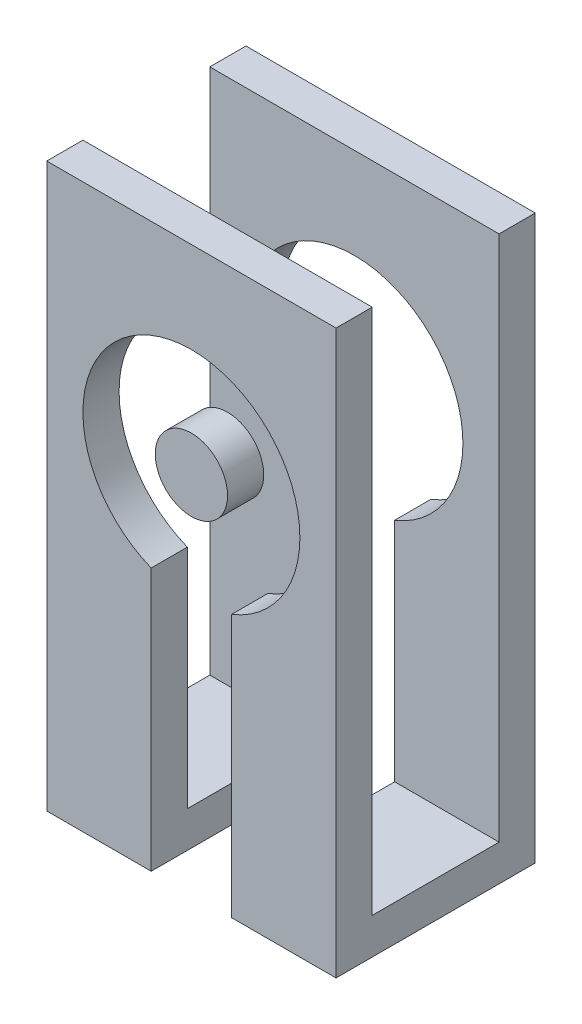
ISO-10303-21;
HEADER;
FILE_DESCRIPTION(('STEP AP214'),'2;1');
FILE_NAME('part.step','',(''),(''),'','','');
FILE_SCHEMA(('AUTOMOTIVE_DESIGN { 1 0 10303 214 1 1 1 1 }'));
ENDSEC;
DATA;
#1=APPLICATION_CONTEXT('core data for automotive mechanical design processes');
#2=APPLICATION_PROTOCOL_DEFINITION('international standard','automotive_design',2000,#1);
#3=PRODUCT_CONTEXT('',#1,'mechanical');
#4=PRODUCT('Part','Part','',(#3));
#5=PRODUCT_RELATED_PRODUCT_CATEGORY('part','',(#4));
#6=PRODUCT_DEFINITION_FORMATION('','',#4);
#7=PRODUCT_DEFINITION_CONTEXT('part definition',#1,'design');
#8=PRODUCT_DEFINITION('design','',#6,#7);
#9=PRODUCT_DEFINITION_SHAPE('','',#8);
#10=(LENGTH_UNIT() NAMED_UNIT(*) SI_UNIT(.MILLI.,.METRE.));
#11=(NAMED_UNIT(*) PLANE_ANGLE_UNIT() SI_UNIT($,.RADIAN.));
#12=(NAMED_UNIT(*) SI_UNIT($,.STERADIAN.) SOLID_ANGLE_UNIT());
#13=UNCERTAINTY_MEASURE_WITH_UNIT(LENGTH_MEASURE(1.E-05),#10,'distance_accuracy_value','');
#14=(GEOMETRIC_REPRESENTATION_CONTEXT(3) GLOBAL_UNCERTAINTY_ASSIGNED_CONTEXT((#13)) GLOBAL_UNIT_ASSIGNED_CONTEXT((#10,
#11,#12)) REPRESENTATION_CONTEXT('',''));
#15=CARTESIAN_POINT('',(0.,0.,0.));
#16=DIRECTION('',(0.,0.,1.));
#17=DIRECTION('',(1.,0.,0.));
#18=AXIS2_PLACEMENT_3D('',#15,#16,#17);
#19=CARTESIAN_POINT('',(-20.,-45.2531458099855,-6.6055019568257));
#20=DIRECTION('',(0.,1.,0.));
#21=DIRECTION('',(0.,0.,1.));
#22=AXIS2_PLACEMENT_3D('',#19,#20,#21);
#23=PLANE('',#22);
#24=DIRECTION('',(0.,0.,-1.));
#25=VECTOR('',#24,1.);
#26=CARTESIAN_POINT('',(5.5576064521285,-45.2531458099855,-6.6055019568257));
#27=LINE('',#26,#25);
#28=CARTESIAN_POINT('',(5.5576064521285,-45.2531458099855,10.9381302617935));
#29=VERTEX_POINT('',#28);
#30=CARTESIAN_POINT('',(5.5576064521285,-45.2531458099855,-6.6055019568257));
#31=VERTEX_POINT('',#30);
#32=EDGE_CURVE('E171',#29,#31,#27,.T.);
#33=ORIENTED_EDGE('',*,*,#32,.F.);
#34=DIRECTION('',(1.,0.,0.));
#35=VECTOR('',#34,1.);
#36=CARTESIAN_POINT('',(-20.,-45.2531458099855,10.9381302617935));
#37=LINE('',#36,#35);
#38=CARTESIAN_POINT('',(20.,-45.2531458099855,10.9381302617935));
#39=VERTEX_POINT('',#38);
#40=EDGE_CURVE('E258',#29,#39,#37,.T.);
#41=ORIENTED_EDGE('',*,*,#40,.T.);
#42=DIRECTION('',(0.,0.,1.));
#43=VECTOR('',#42,1.);
#44=CARTESIAN_POINT('',(20.,-45.2531458099855,-6.6055019568257));
#45=LINE('',#44,#43);
#46=CARTESIAN_POINT('',(20.,-45.2531458099855,-6.6055019568257));
#47=VERTEX_POINT('',#46);
#48=EDGE_CURVE('E187',#47,#39,#45,.T.);
#49=ORIENTED_EDGE('',*,*,#48,.F.);
#50=DIRECTION('',(1.,0.,0.));
#51=VECTOR('',#50,1.);
#52=CARTESIAN_POINT('',(-20.,-45.2531458099855,-6.6055019568257));
#53=LINE('',#52,#51);
#54=EDGE_CURVE('E256',#31,#47,#53,.T.);
#55=ORIENTED_EDGE('',*,*,#54,.F.);
#56=EDGE_LOOP('',(#33,#41,#49,#55));
#57=FACE_BOUND('',#56,.T.);
#58=ADVANCED_FACE('F48',(#57),#23,.T.);
#59=CARTESIAN_POINT('',(-20.,-50.2531458099855,-11.6055019568257));
#60=DIRECTION('',(0.,-1.,0.));
#61=DIRECTION('',(0.,0.,-1.));
#62=AXIS2_PLACEMENT_3D('',#59,#60,#61);
#63=PLANE('',#62);
#64=DIRECTION('',(0.,0.,1.));
#65=VECTOR('',#64,1.);
#66=CARTESIAN_POINT('',(5.5576064521285,-50.2531458099855,-11.6055019568257));
#67=LINE('',#66,#65);
#68=CARTESIAN_POINT('',(5.5576064521285,-50.2531458099855,-11.6055019568257));
#69=VERTEX_POINT('',#68);
#70=CARTESIAN_POINT('',(5.5576064521285,-50.2531458099855,15.9381302617935));
#71=VERTEX_POINT('',#70);
#72=EDGE_CURVE('E194',#69,#71,#67,.T.);
#73=ORIENTED_EDGE('',*,*,#72,.F.);
#74=DIRECTION('',(1.,0.,0.));
#75=VECTOR('',#74,1.);
#76=CARTESIAN_POINT('',(-20.,-50.2531458099855,-11.6055019568257));
#77=LINE('',#76,#75);
#78=CARTESIAN_POINT('',(20.,-50.2531458099855,-11.6055019568257));
#79=VERTEX_POINT('',#78);
#80=EDGE_CURVE('E219',#69,#79,#77,.T.);
#81=ORIENTED_EDGE('',*,*,#80,.T.);
#82=DIRECTION('',(0.,0.,-1.));
#83=VECTOR('',#82,1.);
#84=CARTESIAN_POINT('',(20.,-50.2531458099855,-11.6055019568257));
#85=LINE('',#84,#83);
#86=CARTESIAN_POINT('',(20.,-50.2531458099855,15.9381302617935));
#87=VERTEX_POINT('',#86);
#88=EDGE_CURVE('E228',#87,#79,#85,.T.);
#89=ORIENTED_EDGE('',*,*,#88,.F.);
#90=DIRECTION('',(1.,0.,0.));
#91=VECTOR('',#90,1.);
#92=CARTESIAN_POINT('',(-20.,-50.2531458099855,15.9381302617935));
#93=LINE('',#92,#91);
#94=EDGE_CURVE('E227',#71,#87,#93,.T.);
#95=ORIENTED_EDGE('',*,*,#94,.F.);
#96=EDGE_LOOP('',(#73,#81,#89,#95));
#97=FACE_BOUND('',#96,.T.);
#98=ADVANCED_FACE('F224',(#97),#63,.T.);
#99=DIRECTION('',(0.,0.,1.));
#100=VECTOR('',#99,1.);
#101=CARTESIAN_POINT('',(-5.5576064521285,-45.2531458099855,-6.6055019568257));
#102=LINE('',#101,#100);
#103=CARTESIAN_POINT('',(-5.5576064521285,-45.2531458099855,-6.6055019568257));
#104=VERTEX_POINT('',#103);
#105=CARTESIAN_POINT('',(-5.5576064521285,-45.2531458099855,10.9381302617935));
#106=VERTEX_POINT('',#105);
#107=EDGE_CURVE('E95',#104,#106,#102,.T.);
#108=ORIENTED_EDGE('',*,*,#107,.F.);
#109=CARTESIAN_POINT('',(-20.,-45.2531458099855,-6.6055019568257));
#110=VERTEX_POINT('',#109);
#111=EDGE_CURVE('E280',#110,#104,#53,.T.);
#112=ORIENTED_EDGE('',*,*,#111,.F.);
#113=DIRECTION('',(0.,0.,1.));
#114=VECTOR('',#113,1.);
#115=CARTESIAN_POINT('',(-20.,-45.2531458099855,-6.6055019568257));
#116=LINE('',#115,#114);
#117=CARTESIAN_POINT('',(-20.,-45.2531458099855,10.9381302617935));
#118=VERTEX_POINT('',#117);
#119=EDGE_CURVE('E257',#110,#118,#116,.T.);
#120=ORIENTED_EDGE('',*,*,#119,.T.);
#121=EDGE_CURVE('E254',#118,#106,#37,.T.);
#122=ORIENTED_EDGE('',*,*,#121,.T.);
#123=EDGE_LOOP('',(#108,#112,#120,#122));
#124=FACE_BOUND('',#123,.T.);
#125=ADVANCED_FACE('F320',(#124),#23,.T.);
#126=CARTESIAN_POINT('',(-20.,-45.2531458099855,-6.6055019568257));
#127=DIRECTION('',(0.,0.,1.));
#128=DIRECTION('',(1.,0.,0.));
#129=AXIS2_PLACEMENT_3D('',#126,#127,#128);
#130=PLANE('',#129);
#131=DIRECTION('',(0.,1.,0.));
#132=VECTOR('',#131,1.);
#133=CARTESIAN_POINT('',(5.5576064521285,-45.2531458099855,-6.6055019568257));
#134=LINE('',#133,#132);
#135=CARTESIAN_POINT('',(5.5576064521285,-13.9324445279089,-6.6055019568257));
#136=VERTEX_POINT('',#135);
#137=EDGE_CURVE('E167',#31,#136,#134,.T.);
#138=ORIENTED_EDGE('',*,*,#137,.F.);
#139=ORIENTED_EDGE('',*,*,#54,.T.);
#140=DIRECTION('',(0.,-1.,0.));
#141=VECTOR('',#140,1.);
#142=CARTESIAN_POINT('',(20.,-45.2531458099855,-6.6055019568257));
#143=LINE('',#142,#141);
#144=CARTESIAN_POINT('',(20.,27.5804653060911,-6.6055019568257));
#145=VERTEX_POINT('',#144);
#146=EDGE_CURVE('E205',#145,#47,#143,.T.);
#147=ORIENTED_EDGE('',*,*,#146,.F.);
#148=DIRECTION('',(1.,0.,0.));
#149=VECTOR('',#148,1.);
#150=CARTESIAN_POINT('',(-20.,27.5804653060911,-6.6055019568257));
#151=LINE('',#150,#149);
#152=CARTESIAN_POINT('',(-20.,27.5804653060911,-6.6055019568257));
#153=VERTEX_POINT('',#152);
#154=EDGE_CURVE('E277',#153,#145,#151,.T.);
#155=ORIENTED_EDGE('',*,*,#154,.F.);
#156=DIRECTION('',(0.,-1.,0.));
#157=VECTOR('',#156,1.);
#158=CARTESIAN_POINT('',(-20.,-45.2531458099855,-6.6055019568257));
#159=LINE('',#158,#157);
#160=EDGE_CURVE('E282',#153,#110,#159,.T.);
#161=ORIENTED_EDGE('',*,*,#160,.T.);
#162=ORIENTED_EDGE('',*,*,#111,.T.);
#163=DIRECTION('',(0.,-1.,0.));
#164=VECTOR('',#163,1.);
#165=CARTESIAN_POINT('',(-5.5576064521285,-45.2531458099855,-6.6055019568257));
#166=LINE('',#165,#164);
#167=CARTESIAN_POINT('',(-5.5576064521285,-13.9324445279089,-6.6055019568257));
#168=VERTEX_POINT('',#167);
#169=EDGE_CURVE('E183',#168,#104,#166,.T.);
#170=ORIENTED_EDGE('',*,*,#169,.F.);
#171=CARTESIAN_POINT('',(0.,0.,-6.6055019568257));
#172=DIRECTION('',(0.,0.,1.));
#173=DIRECTION('',(1.,0.,0.));
#174=AXIS2_PLACEMENT_3D('',#171,#172,#173);
#175=CIRCLE('',#174,15.);
#176=EDGE_CURVE('E178',#136,#168,#175,.T.);
#177=ORIENTED_EDGE('',*,*,#176,.F.);
#178=EDGE_LOOP('',(#138,#139,#147,#155,#161,#162,#170,#177));
#179=FACE_BOUND('',#178,.T.);
#180=ADVANCED_FACE('F181',(#179),#130,.T.);
#181=CARTESIAN_POINT('',(-20.,27.5804653060911,-6.6055019568257));
#182=DIRECTION('',(0.,1.,0.));
#183=DIRECTION('',(0.,0.,1.));
#184=AXIS2_PLACEMENT_3D('',#181,#182,#183);
#185=PLANE('',#184);
#186=ORIENTED_EDGE('',*,*,#154,.T.);
#187=DIRECTION('',(0.,0.,1.));
#188=VECTOR('',#187,1.);
#189=CARTESIAN_POINT('',(20.,27.5804653060911,-6.6055019568257));
#190=LINE('',#189,#188);
#191=CARTESIAN_POINT('',(20.,27.5804653060911,-11.6055019568257));
#192=VERTEX_POINT('',#191);
#193=EDGE_CURVE('E295',#192,#145,#190,.T.);
#194=ORIENTED_EDGE('',*,*,#193,.F.);
#195=DIRECTION('',(1.,0.,0.));
#196=VECTOR('',#195,1.);
#197=CARTESIAN_POINT('',(-20.,27.5804653060911,-11.6055019568257));
#198=LINE('',#197,#196);
#199=CARTESIAN_POINT('',(-20.,27.5804653060911,-11.6055019568257));
#200=VERTEX_POINT('',#199);
#201=EDGE_CURVE('E274',#200,#192,#198,.T.);
#202=ORIENTED_EDGE('',*,*,#201,.F.);
#203=DIRECTION('',(0.,0.,1.));
#204=VECTOR('',#203,1.);
#205=CARTESIAN_POINT('',(-20.,27.5804653060911,-6.6055019568257));
#206=LINE('',#205,#204);
#207=EDGE_CURVE('E279',#200,#153,#206,.T.);
#208=ORIENTED_EDGE('',*,*,#207,.T.);
#209=EDGE_LOOP('',(#186,#194,#202,#208));
#210=FACE_BOUND('',#209,.T.);
#211=ADVANCED_FACE('F312',(#210),#185,.T.);
#212=CARTESIAN_POINT('',(-20.,-50.2531458099855,-11.6055019568257));
#213=DIRECTION('',(0.,0.,-1.));
#214=DIRECTION('',(-1.,0.,0.));
#215=AXIS2_PLACEMENT_3D('',#212,#213,#214);
#216=PLANE('',#215);
#217=DIRECTION('',(0.,-1.,0.));
#218=VECTOR('',#217,1.);
#219=CARTESIAN_POINT('',(5.5576064521285,-50.2531458099855,-11.6055019568257));
#220=LINE('',#219,#218);
#221=CARTESIAN_POINT('',(5.5576064521285,-13.9324445279089,-11.6055019568257));
#222=VERTEX_POINT('',#221);
#223=EDGE_CURVE('E192',#222,#69,#220,.T.);
#224=ORIENTED_EDGE('',*,*,#223,.F.);
#225=CARTESIAN_POINT('',(0.,0.,-11.6055019568257));
#226=DIRECTION('',(0.,0.,-1.));
#227=DIRECTION('',(-1.,0.,0.));
#228=AXIS2_PLACEMENT_3D('',#225,#226,#227);
#229=CIRCLE('',#228,15.);
#230=CARTESIAN_POINT('',(-5.5576064521285,-13.9324445279089,-11.6055019568257));
#231=VERTEX_POINT('',#230);
#232=EDGE_CURVE('E58',#231,#222,#229,.T.);
#233=ORIENTED_EDGE('',*,*,#232,.F.);
#234=DIRECTION('',(0.,1.,0.));
#235=VECTOR('',#234,1.);
#236=CARTESIAN_POINT('',(-5.5576064521285,-50.2531458099855,-11.6055019568257));
#237=LINE('',#236,#235);
#238=CARTESIAN_POINT('',(-5.5576064521285,-50.2531458099855,-11.6055019568257));
#239=VERTEX_POINT('',#238);
#240=EDGE_CURVE('E201',#239,#231,#237,.T.);
#241=ORIENTED_EDGE('',*,*,#240,.F.);
#242=CARTESIAN_POINT('',(-20.,-50.2531458099855,-11.6055019568257));
#243=VERTEX_POINT('',#242);
#244=EDGE_CURVE('E233',#243,#239,#77,.T.);
#245=ORIENTED_EDGE('',*,*,#244,.F.);
#246=DIRECTION('',(0.,1.,0.));
#247=VECTOR('',#246,1.);
#248=CARTESIAN_POINT('',(-20.,-50.2531458099855,-11.6055019568257));
#249=LINE('',#248,#247);
#250=EDGE_CURVE('E276',#243,#200,#249,.T.);
#251=ORIENTED_EDGE('',*,*,#250,.T.);
#252=ORIENTED_EDGE('',*,*,#201,.T.);
#253=DIRECTION('',(0.,1.,0.));
#254=VECTOR('',#253,1.);
#255=CARTESIAN_POINT('',(20.,-50.2531458099855,-11.6055019568257));
#256=LINE('',#255,#254);
#257=EDGE_CURVE('E298',#79,#192,#256,.T.);
#258=ORIENTED_EDGE('',*,*,#257,.F.);
#259=ORIENTED_EDGE('',*,*,#80,.F.);
#260=EDGE_LOOP('',(#224,#233,#241,#245,#251,#252,#258,#259));
#261=FACE_BOUND('',#260,.T.);
#262=ADVANCED_FACE('F215',(#261),#216,.T.);
#263=DIRECTION('',(0.,0.,-1.));
#264=VECTOR('',#263,1.);
#265=CARTESIAN_POINT('',(-5.5576064521285,-50.2531458099855,-11.6055019568257));
#266=LINE('',#265,#264);
#267=CARTESIAN_POINT('',(-5.5576064521285,-50.2531458099855,15.9381302617935));
#268=VERTEX_POINT('',#267);
#269=EDGE_CURVE('E195',#268,#239,#266,.T.);
#270=ORIENTED_EDGE('',*,*,#269,.F.);
#271=CARTESIAN_POINT('',(-20.,-50.2531458099855,15.9381302617935));
#272=VERTEX_POINT('',#271);
#273=EDGE_CURVE('E235',#272,#268,#93,.T.);
#274=ORIENTED_EDGE('',*,*,#273,.F.);
#275=DIRECTION('',(0.,0.,-1.));
#276=VECTOR('',#275,1.);
#277=CARTESIAN_POINT('',(-20.,-50.2531458099855,-11.6055019568257));
#278=LINE('',#277,#276);
#279=EDGE_CURVE('E238',#272,#243,#278,.T.);
#280=ORIENTED_EDGE('',*,*,#279,.T.);
#281=ORIENTED_EDGE('',*,*,#244,.T.);
#282=EDGE_LOOP('',(#270,#274,#280,#281));
#283=FACE_BOUND('',#282,.T.);
#284=ADVANCED_FACE('F326',(#283),#63,.T.);
#285=CARTESIAN_POINT('',(-20.,-50.2531458099855,15.9381302617935));
#286=DIRECTION('',(0.,0.,1.));
#287=DIRECTION('',(1.,0.,0.));
#288=AXIS2_PLACEMENT_3D('',#285,#286,#287);
#289=PLANE('',#288);
#290=DIRECTION('',(0.,1.,0.));
#291=VECTOR('',#290,1.);
#292=CARTESIAN_POINT('',(5.5576064521285,-50.2531458099855,15.9381302617935));
#293=LINE('',#292,#291);
#294=CARTESIAN_POINT('',(5.5576064521285,-13.9324445279089,15.9381302617935));
#295=VERTEX_POINT('',#294);
#296=EDGE_CURVE('E197',#71,#295,#293,.T.);
#297=ORIENTED_EDGE('',*,*,#296,.F.);
#298=ORIENTED_EDGE('',*,*,#94,.T.);
#299=DIRECTION('',(0.,-1.,0.));
#300=VECTOR('',#299,1.);
#301=CARTESIAN_POINT('',(20.,-50.2531458099855,15.9381302617935));
#302=LINE('',#301,#300);
#303=CARTESIAN_POINT('',(20.,27.5804653060911,15.9381302617935));
#304=VERTEX_POINT('',#303);
#305=EDGE_CURVE('E302',#304,#87,#302,.T.);
#306=ORIENTED_EDGE('',*,*,#305,.F.);
#307=DIRECTION('',(1.,0.,0.));
#308=VECTOR('',#307,1.);
#309=CARTESIAN_POINT('',(-20.,27.5804653060911,15.9381302617935));
#310=LINE('',#309,#308);
#311=CARTESIAN_POINT('',(-20.,27.5804653060911,15.9381302617935));
#312=VERTEX_POINT('',#311);
#313=EDGE_CURVE('E242',#312,#304,#310,.T.);
#314=ORIENTED_EDGE('',*,*,#313,.F.);
#315=DIRECTION('',(0.,-1.,0.));
#316=VECTOR('',#315,1.);
#317=CARTESIAN_POINT('',(-20.,-50.2531458099855,15.9381302617935));
#318=LINE('',#317,#316);
#319=EDGE_CURVE('E232',#312,#272,#318,.T.);
#320=ORIENTED_EDGE('',*,*,#319,.T.);
#321=ORIENTED_EDGE('',*,*,#273,.T.);
#322=DIRECTION('',(0.,-1.,0.));
#323=VECTOR('',#322,1.);
#324=CARTESIAN_POINT('',(-5.5576064521285,-50.2531458099855,15.9381302617935));
#325=LINE('',#324,#323);
#326=CARTESIAN_POINT('',(-5.5576064521285,-13.9324445279089,15.9381302617935));
#327=VERTEX_POINT('',#326);
#328=EDGE_CURVE('E207',#327,#268,#325,.T.);
#329=ORIENTED_EDGE('',*,*,#328,.F.);
#330=CARTESIAN_POINT('',(0.,0.,15.9381302617935));
#331=DIRECTION('',(0.,0.,1.));
#332=DIRECTION('',(1.,0.,0.));
#333=AXIS2_PLACEMENT_3D('',#330,#331,#332);
#334=CIRCLE('',#333,15.);
#335=EDGE_CURVE('E175',#295,#327,#334,.T.);
#336=ORIENTED_EDGE('',*,*,#335,.F.);
#337=EDGE_LOOP('',(#297,#298,#306,#314,#320,#321,#329,#336));
#338=FACE_BOUND('',#337,.T.);
#339=ADVANCED_FACE('F50',(#338),#289,.T.);
#340=CARTESIAN_POINT('',(-20.,27.5804653060911,15.9381302617935));
#341=DIRECTION('',(0.,1.,0.));
#342=DIRECTION('',(0.,0.,1.));
#343=AXIS2_PLACEMENT_3D('',#340,#341,#342);
#344=PLANE('',#343);
#345=ORIENTED_EDGE('',*,*,#313,.T.);
#346=DIRECTION('',(0.,0.,1.));
#347=VECTOR('',#346,1.);
#348=CARTESIAN_POINT('',(20.,27.5804653060911,15.9381302617935));
#349=LINE('',#348,#347);
#350=CARTESIAN_POINT('',(20.,27.5804653060911,10.9381302617935));
#351=VERTEX_POINT('',#350);
#352=EDGE_CURVE('E304',#351,#304,#349,.T.);
#353=ORIENTED_EDGE('',*,*,#352,.F.);
#354=DIRECTION('',(1.,0.,0.));
#355=VECTOR('',#354,1.);
#356=CARTESIAN_POINT('',(-20.,27.5804653060911,10.9381302617935));
#357=LINE('',#356,#355);
#358=CARTESIAN_POINT('',(-20.,27.5804653060911,10.9381302617935));
#359=VERTEX_POINT('',#358);
#360=EDGE_CURVE('E252',#359,#351,#357,.T.);
#361=ORIENTED_EDGE('',*,*,#360,.F.);
#362=DIRECTION('',(0.,0.,1.));
#363=VECTOR('',#362,1.);
#364=CARTESIAN_POINT('',(-20.,27.5804653060911,15.9381302617935));
#365=LINE('',#364,#363);
#366=EDGE_CURVE('E244',#359,#312,#365,.T.);
#367=ORIENTED_EDGE('',*,*,#366,.T.);
#368=EDGE_LOOP('',(#345,#353,#361,#367));
#369=FACE_BOUND('',#368,.T.);
#370=ADVANCED_FACE('F321',(#369),#344,.T.);
#371=CARTESIAN_POINT('',(-20.,-45.2531458099855,10.9381302617935));
#372=DIRECTION('',(0.,0.,-1.));
#373=DIRECTION('',(-1.,0.,0.));
#374=AXIS2_PLACEMENT_3D('',#371,#372,#373);
#375=PLANE('',#374);
#376=DIRECTION('',(0.,-1.,0.));
#377=VECTOR('',#376,1.);
#378=CARTESIAN_POINT('',(5.5576064521285,-45.2531458099855,10.9381302617935));
#379=LINE('',#378,#377);
#380=CARTESIAN_POINT('',(5.5576064521285,-13.9324445279089,10.9381302617935));
#381=VERTEX_POINT('',#380);
#382=EDGE_CURVE('E198',#381,#29,#379,.T.);
#383=ORIENTED_EDGE('',*,*,#382,.F.);
#384=CARTESIAN_POINT('',(0.,0.,10.9381302617935));
#385=DIRECTION('',(0.,0.,-1.));
#386=DIRECTION('',(-1.,0.,0.));
#387=AXIS2_PLACEMENT_3D('',#384,#385,#386);
#388=CIRCLE('',#387,15.);
#389=CARTESIAN_POINT('',(-5.5576064521285,-13.9324445279089,10.9381302617935));
#390=VERTEX_POINT('',#389);
#391=EDGE_CURVE('E162',#390,#381,#388,.T.);
#392=ORIENTED_EDGE('',*,*,#391,.F.);
#393=DIRECTION('',(0.,1.,0.));
#394=VECTOR('',#393,1.);
#395=CARTESIAN_POINT('',(-5.5576064521285,-45.2531458099855,10.9381302617935));
#396=LINE('',#395,#394);
#397=EDGE_CURVE('E90',#106,#390,#396,.T.);
#398=ORIENTED_EDGE('',*,*,#397,.F.);
#399=ORIENTED_EDGE('',*,*,#121,.F.);
#400=DIRECTION('',(0.,1.,0.));
#401=VECTOR('',#400,1.);
#402=CARTESIAN_POINT('',(-20.,-45.2531458099855,10.9381302617935));
#403=LINE('',#402,#401);
#404=EDGE_CURVE('E249',#118,#359,#403,.T.);
#405=ORIENTED_EDGE('',*,*,#404,.T.);
#406=ORIENTED_EDGE('',*,*,#360,.T.);
#407=DIRECTION('',(0.,1.,0.));
#408=VECTOR('',#407,1.);
#409=CARTESIAN_POINT('',(20.,-45.2531458099855,10.9381302617935));
#410=LINE('',#409,#408);
#411=EDGE_CURVE('E269',#39,#351,#410,.T.);
#412=ORIENTED_EDGE('',*,*,#411,.F.);
#413=ORIENTED_EDGE('',*,*,#40,.F.);
#414=EDGE_LOOP('',(#383,#392,#398,#399,#405,#406,#412,#413));
#415=FACE_BOUND('',#414,.T.);
#416=ADVANCED_FACE('F267',(#415),#375,.T.);
#417=CARTESIAN_POINT('',(-20.,0.,-70.));
#418=DIRECTION('',(-1.,0.,0.));
#419=DIRECTION('',(0.,0.,1.));
#420=AXIS2_PLACEMENT_3D('',#417,#418,#419);
#421=PLANE('',#420);
#422=ORIENTED_EDGE('',*,*,#119,.F.);
#423=ORIENTED_EDGE('',*,*,#160,.F.);
#424=ORIENTED_EDGE('',*,*,#207,.F.);
#425=ORIENTED_EDGE('',*,*,#250,.F.);
#426=ORIENTED_EDGE('',*,*,#279,.F.);
#427=ORIENTED_EDGE('',*,*,#319,.F.);
#428=ORIENTED_EDGE('',*,*,#366,.F.);
#429=ORIENTED_EDGE('',*,*,#404,.F.);
#430=EDGE_LOOP('',(#422,#423,#424,#425,#426,#427,#428,#429));
#431=FACE_BOUND('',#430,.T.);
#432=ADVANCED_FACE('F316',(#431),#421,.T.);
#433=CARTESIAN_POINT('',(20.,0.,-70.));
#434=DIRECTION('',(-1.,0.,0.));
#435=DIRECTION('',(0.,0.,1.));
#436=AXIS2_PLACEMENT_3D('',#433,#434,#435);
#437=PLANE('',#436);
#438=ORIENTED_EDGE('',*,*,#48,.T.);
#439=ORIENTED_EDGE('',*,*,#411,.T.);
#440=ORIENTED_EDGE('',*,*,#352,.T.);
#441=ORIENTED_EDGE('',*,*,#305,.T.);
#442=ORIENTED_EDGE('',*,*,#88,.T.);
#443=ORIENTED_EDGE('',*,*,#257,.T.);
#444=ORIENTED_EDGE('',*,*,#193,.T.);
#445=ORIENTED_EDGE('',*,*,#146,.T.);
#446=EDGE_LOOP('',(#438,#439,#440,#441,#442,#443,#444,#445));
#447=FACE_BOUND('',#446,.T.);
#448=ADVANCED_FACE('F306',(#447),#437,.F.);
#449=CARTESIAN_POINT('',(-5.5576064521285,-13.9324445279089,-30.));
#450=DIRECTION('',(-1.,0.,0.));
#451=DIRECTION('',(0.,0.,1.));
#452=AXIS2_PLACEMENT_3D('',#449,#450,#451);
#453=PLANE('',#452);
#454=ORIENTED_EDGE('',*,*,#240,.T.);
#455=DIRECTION('',(0.,0.,1.));
#456=VECTOR('',#455,1.);
#457=CARTESIAN_POINT('',(-5.5576064521285,-13.9324445279089,-30.));
#458=LINE('',#457,#456);
#459=EDGE_CURVE('E204',#231,#168,#458,.T.);
#460=ORIENTED_EDGE('',*,*,#459,.T.);
#461=ORIENTED_EDGE('',*,*,#169,.T.);
#462=ORIENTED_EDGE('',*,*,#107,.T.);
#463=ORIENTED_EDGE('',*,*,#397,.T.);
#464=EDGE_CURVE('E209',#390,#327,#458,.T.);
#465=ORIENTED_EDGE('',*,*,#464,.T.);
#466=ORIENTED_EDGE('',*,*,#328,.T.);
#467=ORIENTED_EDGE('',*,*,#269,.T.);
#468=EDGE_LOOP('',(#454,#460,#461,#462,#463,#465,#466,#467));
#469=FACE_BOUND('',#468,.T.);
#470=ADVANCED_FACE('F212',(#469),#453,.F.);
#471=CARTESIAN_POINT('',(5.5576064521285,-13.9324445279089,-30.));
#472=DIRECTION('',(1.,0.,0.));
#473=DIRECTION('',(0.,1.,0.));
#474=AXIS2_PLACEMENT_3D('',#471,#472,#473);
#475=PLANE('',#474);
#476=ORIENTED_EDGE('',*,*,#223,.T.);
#477=ORIENTED_EDGE('',*,*,#72,.T.);
#478=ORIENTED_EDGE('',*,*,#296,.T.);
#479=DIRECTION('',(0.,0.,1.));
#480=VECTOR('',#479,1.);
#481=CARTESIAN_POINT('',(5.5576064521285,-13.9324445279089,-30.));
#482=LINE('',#481,#480);
#483=EDGE_CURVE('E52',#381,#295,#482,.T.);
#484=ORIENTED_EDGE('',*,*,#483,.F.);
#485=ORIENTED_EDGE('',*,*,#382,.T.);
#486=ORIENTED_EDGE('',*,*,#32,.T.);
#487=ORIENTED_EDGE('',*,*,#137,.T.);
#488=EDGE_CURVE('E12',#222,#136,#482,.T.);
#489=ORIENTED_EDGE('',*,*,#488,.F.);
#490=EDGE_LOOP('',(#476,#477,#478,#484,#485,#486,#487,#489));
#491=FACE_BOUND('',#490,.T.);
#492=ADVANCED_FACE('F168',(#491),#475,.F.);
#493=CARTESIAN_POINT('',(0.,0.,-30.));
#494=DIRECTION('',(0.,0.,1.));
#495=DIRECTION('',(1.,0.,0.));
#496=AXIS2_PLACEMENT_3D('',#493,#494,#495);
#497=CYLINDRICAL_SURFACE('',#496,15.);
#498=ORIENTED_EDGE('',*,*,#335,.T.);
#499=ORIENTED_EDGE('',*,*,#464,.F.);
#500=ORIENTED_EDGE('',*,*,#391,.T.);
#501=ORIENTED_EDGE('',*,*,#483,.T.);
#502=EDGE_LOOP('',(#498,#499,#500,#501));
#503=FACE_BOUND('',#502,.T.);
#504=ADVANCED_FACE('F328',(#503),#497,.F.);
#505=ORIENTED_EDGE('',*,*,#176,.T.);
#506=ORIENTED_EDGE('',*,*,#459,.F.);
#507=ORIENTED_EDGE('',*,*,#232,.T.);
#508=ORIENTED_EDGE('',*,*,#488,.T.);
#509=EDGE_LOOP('',(#505,#506,#507,#508));
#510=FACE_BOUND('',#509,.T.);
#511=ADVANCED_FACE('F177',(#510),#497,.F.);
#512=CLOSED_SHELL('',(#58,#98,#125,#180,#211,#262,#284,#339,#370,#416,#432,#448,#470,#492,#504,#511));
#513=MANIFOLD_SOLID_BREP('B2',#512);
#514=CARTESIAN_POINT('',(-20.,-45.2531458099855,10.9381302617935));
#515=DIRECTION('',(0.,0.,-1.));
#516=DIRECTION('',(-1.,0.,0.));
#517=AXIS2_PLACEMENT_3D('',#514,#515,#516);
#518=PLANE('',#517);
#519=CARTESIAN_POINT('',(0.,0.,10.9381302617935));
#520=DIRECTION('',(0.,0.,-1.));
#521=DIRECTION('',(-1.,0.,0.));
#522=AXIS2_PLACEMENT_3D('',#519,#520,#521);
#523=CIRCLE('',#522,5.);
#524=CARTESIAN_POINT('',(-5.,0.,10.9381302617935));
#525=VERTEX_POINT('',#524);
#526=EDGE_CURVE('E477',#525,#525,#523,.T.);
#527=ORIENTED_EDGE('',*,*,#526,.T.);
#528=EDGE_LOOP('',(#527));
#529=FACE_BOUND('',#528,.T.);
#530=ADVANCED_FACE('F470',(#529),#518,.T.);
#531=CARTESIAN_POINT('',(0.,0.,-30.));
#532=DIRECTION('',(0.,0.,1.));
#533=DIRECTION('',(1.,0.,0.));
#534=AXIS2_PLACEMENT_3D('',#531,#532,#533);
#535=CYLINDRICAL_SURFACE('',#534,5.);
#536=CARTESIAN_POINT('',(0.,0.,15.9381302617935));
#537=DIRECTION('',(0.,0.,1.));
#538=DIRECTION('',(1.,0.,0.));
#539=AXIS2_PLACEMENT_3D('',#536,#537,#538);
#540=CIRCLE('',#539,5.);
#541=CARTESIAN_POINT('',(5.,0.,15.9381302617935));
#542=VERTEX_POINT('',#541);
#543=EDGE_CURVE('E47',#542,#542,#540,.T.);
#544=ORIENTED_EDGE('',*,*,#543,.F.);
#545=EDGE_LOOP('',(#544));
#546=FACE_BOUND('',#545,.T.);
#547=ORIENTED_EDGE('',*,*,#526,.F.);
#548=EDGE_LOOP('',(#547));
#549=FACE_BOUND('',#548,.T.);
#550=ADVANCED_FACE('F484',(#546,#549),#535,.T.);
#551=CARTESIAN_POINT('',(-20.,-50.2531458099855,15.9381302617935));
#552=DIRECTION('',(0.,0.,1.));
#553=DIRECTION('',(1.,0.,0.));
#554=AXIS2_PLACEMENT_3D('',#551,#552,#553);
#555=PLANE('',#554);
#556=ORIENTED_EDGE('',*,*,#543,.T.);
#557=EDGE_LOOP('',(#556));
#558=FACE_BOUND('',#557,.T.);
#559=ADVANCED_FACE('F472',(#558),#555,.T.);
#560=CLOSED_SHELL('',(#530,#550,#559));
#561=MANIFOLD_SOLID_BREP('B6',#560);
#562=ADVANCED_BREP_SHAPE_REPRESENTATION('',(#18,#513,#561),#14);
#563=SHAPE_DEFINITION_REPRESENTATION(#9,#562);
ENDSEC;
END-ISO-10303-21;
